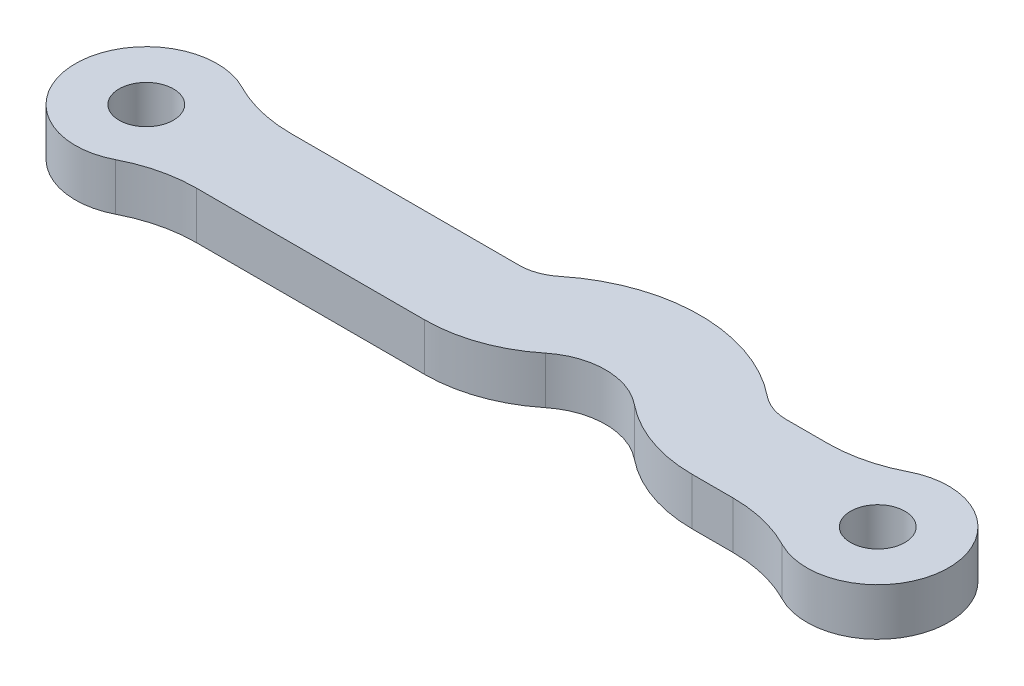
ISO-10303-21;
HEADER;
FILE_DESCRIPTION(('STEP AP214'),'2;1');
FILE_NAME('part.step','',(''),(''),'','','');
FILE_SCHEMA(('AUTOMOTIVE_DESIGN { 1 0 10303 214 1 1 1 1 }'));
ENDSEC;
DATA;
#1=APPLICATION_CONTEXT('core data for automotive mechanical design processes');
#2=APPLICATION_PROTOCOL_DEFINITION('international standard','automotive_design',2000,#1);
#3=PRODUCT_CONTEXT('',#1,'mechanical');
#4=PRODUCT('Part','Part','',(#3));
#5=PRODUCT_RELATED_PRODUCT_CATEGORY('part','',(#4));
#6=PRODUCT_DEFINITION_FORMATION('','',#4);
#7=PRODUCT_DEFINITION_CONTEXT('part definition',#1,'design');
#8=PRODUCT_DEFINITION('design','',#6,#7);
#9=PRODUCT_DEFINITION_SHAPE('','',#8);
#10=(LENGTH_UNIT() NAMED_UNIT(*) SI_UNIT(.MILLI.,.METRE.));
#11=(NAMED_UNIT(*) PLANE_ANGLE_UNIT() SI_UNIT($,.RADIAN.));
#12=(NAMED_UNIT(*) SI_UNIT($,.STERADIAN.) SOLID_ANGLE_UNIT());
#13=UNCERTAINTY_MEASURE_WITH_UNIT(LENGTH_MEASURE(1.E-05),#10,'distance_accuracy_value','');
#14=(GEOMETRIC_REPRESENTATION_CONTEXT(3) GLOBAL_UNCERTAINTY_ASSIGNED_CONTEXT((#13)) GLOBAL_UNIT_ASSIGNED_CONTEXT((#10,
#11,#12)) REPRESENTATION_CONTEXT('',''));
#15=CARTESIAN_POINT('',(0.,0.,0.));
#16=DIRECTION('',(0.,0.,1.));
#17=DIRECTION('',(1.,0.,0.));
#18=AXIS2_PLACEMENT_3D('',#15,#16,#17);
#19=CARTESIAN_POINT('',(0.,2.,2.));
#20=DIRECTION('',(0.,0.,1.));
#21=DIRECTION('',(1.,0.,0.));
#22=AXIS2_PLACEMENT_3D('',#19,#20,#21);
#23=PLANE('',#22);
#24=DIRECTION('',(-1.,0.,0.));
#25=VECTOR('',#24,1.);
#26=CARTESIAN_POINT('',(0.,2.,2.));
#27=LINE('',#26,#25);
#28=CARTESIAN_POINT('',(26.8268943743823,2.,2.));
#29=VERTEX_POINT('',#28);
#30=CARTESIAN_POINT('',(25.0912127128692,2.,2.));
#31=VERTEX_POINT('',#30);
#32=EDGE_CURVE('E287',#29,#31,#27,.T.);
#33=ORIENTED_EDGE('',*,*,#32,.T.);
#34=DIRECTION('',(0.,-1.,0.));
#35=VECTOR('',#34,1.);
#36=CARTESIAN_POINT('',(25.0912127128692,2.,2.));
#37=LINE('',#36,#35);
#38=CARTESIAN_POINT('',(25.0912127128692,0.,2.));
#39=VERTEX_POINT('',#38);
#40=EDGE_CURVE('E216',#31,#39,#37,.T.);
#41=ORIENTED_EDGE('',*,*,#40,.T.);
#42=DIRECTION('',(-1.,0.,0.));
#43=VECTOR('',#42,1.);
#44=CARTESIAN_POINT('',(0.,0.,2.));
#45=LINE('',#44,#43);
#46=CARTESIAN_POINT('',(26.8268943743823,0.,2.));
#47=VERTEX_POINT('',#46);
#48=EDGE_CURVE('E273',#47,#39,#45,.T.);
#49=ORIENTED_EDGE('',*,*,#48,.F.);
#50=DIRECTION('',(0.,-1.,0.));
#51=VECTOR('',#50,1.);
#52=CARTESIAN_POINT('',(26.8268943743823,2.,2.));
#53=LINE('',#52,#51);
#54=EDGE_CURVE('E191',#47,#29,#53,.F.);
#55=ORIENTED_EDGE('',*,*,#54,.T.);
#56=EDGE_LOOP('',(#33,#41,#49,#55));
#57=FACE_BOUND('',#56,.T.);
#58=ADVANCED_FACE('F36',(#57),#23,.T.);
#59=CARTESIAN_POINT('',(30.95,2.,0.));
#60=DIRECTION('',(0.,-1.,0.));
#61=DIRECTION('',(0.,0.,-1.));
#62=AXIS2_PLACEMENT_3D('',#59,#60,#61);
#63=CYLINDRICAL_SURFACE('',#62,3.);
#64=CARTESIAN_POINT('',(30.95,0.,0.));
#65=DIRECTION('',(0.,1.,0.));
#66=DIRECTION('',(0.,0.,1.));
#67=AXIS2_PLACEMENT_3D('',#64,#65,#66);
#68=CIRCLE('',#67,3.);
#69=CARTESIAN_POINT('',(29.5756314581274,0.,2.66666666666667));
#70=VERTEX_POINT('',#69);
#71=CARTESIAN_POINT('',(29.5756314581274,0.,-2.66666666666667));
#72=VERTEX_POINT('',#71);
#73=EDGE_CURVE('E162',#70,#72,#68,.T.);
#74=ORIENTED_EDGE('',*,*,#73,.T.);
#75=DIRECTION('',(0.,-1.,0.));
#76=VECTOR('',#75,1.);
#77=CARTESIAN_POINT('',(29.5756314581274,2.,-2.66666666666667));
#78=LINE('',#77,#76);
#79=CARTESIAN_POINT('',(29.5756314581274,2.,-2.66666666666667));
#80=VERTEX_POINT('',#79);
#81=EDGE_CURVE('E170',#72,#80,#78,.F.);
#82=ORIENTED_EDGE('',*,*,#81,.T.);
#83=CARTESIAN_POINT('',(30.95,2.,0.));
#84=DIRECTION('',(0.,1.,0.));
#85=DIRECTION('',(0.,0.,1.));
#86=AXIS2_PLACEMENT_3D('',#83,#84,#85);
#87=CIRCLE('',#86,3.);
#88=CARTESIAN_POINT('',(29.5756314581274,2.,2.66666666666667));
#89=VERTEX_POINT('',#88);
#90=EDGE_CURVE('E291',#89,#80,#87,.T.);
#91=ORIENTED_EDGE('',*,*,#90,.F.);
#92=DIRECTION('',(0.,-1.,0.));
#93=VECTOR('',#92,1.);
#94=CARTESIAN_POINT('',(29.5756314581274,2.,2.66666666666667));
#95=LINE('',#94,#93);
#96=EDGE_CURVE('E178',#89,#70,#95,.T.);
#97=ORIENTED_EDGE('',*,*,#96,.T.);
#98=EDGE_LOOP('',(#74,#82,#91,#97));
#99=FACE_BOUND('',#98,.T.);
#100=ADVANCED_FACE('F333',(#99),#63,.T.);
#101=CARTESIAN_POINT('',(0.,2.,-2.));
#102=DIRECTION('',(0.,0.,-1.));
#103=DIRECTION('',(-1.,0.,0.));
#104=AXIS2_PLACEMENT_3D('',#101,#102,#103);
#105=PLANE('',#104);
#106=DIRECTION('',(1.,0.,0.));
#107=VECTOR('',#106,1.);
#108=CARTESIAN_POINT('',(0.,0.,-2.));
#109=LINE('',#108,#107);
#110=CARTESIAN_POINT('',(25.0912127128692,0.,-2.));
#111=VERTEX_POINT('',#110);
#112=CARTESIAN_POINT('',(26.8268943743823,0.,-2.));
#113=VERTEX_POINT('',#112);
#114=EDGE_CURVE('E148',#111,#113,#109,.T.);
#115=ORIENTED_EDGE('',*,*,#114,.F.);
#116=DIRECTION('',(0.,-1.,0.));
#117=VECTOR('',#116,1.);
#118=CARTESIAN_POINT('',(25.0912127128692,2.,-2.));
#119=LINE('',#118,#117);
#120=CARTESIAN_POINT('',(25.0912127128692,2.,-2.));
#121=VERTEX_POINT('',#120);
#122=EDGE_CURVE('E239',#111,#121,#119,.F.);
#123=ORIENTED_EDGE('',*,*,#122,.T.);
#124=DIRECTION('',(1.,0.,0.));
#125=VECTOR('',#124,1.);
#126=CARTESIAN_POINT('',(0.,2.,-2.));
#127=LINE('',#126,#125);
#128=CARTESIAN_POINT('',(26.8268943743823,2.,-2.));
#129=VERTEX_POINT('',#128);
#130=EDGE_CURVE('E176',#121,#129,#127,.T.);
#131=ORIENTED_EDGE('',*,*,#130,.T.);
#132=DIRECTION('',(0.,-1.,0.));
#133=VECTOR('',#132,1.);
#134=CARTESIAN_POINT('',(26.8268943743823,2.,-2.));
#135=LINE('',#134,#133);
#136=EDGE_CURVE('E169',#129,#113,#135,.T.);
#137=ORIENTED_EDGE('',*,*,#136,.T.);
#138=EDGE_LOOP('',(#115,#123,#131,#137));
#139=FACE_BOUND('',#138,.T.);
#140=ADVANCED_FACE('F174',(#139),#105,.T.);
#141=CARTESIAN_POINT('',(19.4343584633769,2.,3.));
#142=DIRECTION('',(0.,-1.,0.));
#143=DIRECTION('',(0.,0.,-1.));
#144=AXIS2_PLACEMENT_3D('',#141,#142,#143);
#145=CYLINDRICAL_SURFACE('',#144,7.);
#146=CARTESIAN_POINT('',(19.4343584633769,2.,3.));
#147=DIRECTION('',(0.,1.,0.));
#148=DIRECTION('',(0.,0.,1.));
#149=AXIS2_PLACEMENT_3D('',#146,#147,#148);
#150=CIRCLE('',#149,7.);
#151=CARTESIAN_POINT('',(23.8341339907598,2.,-2.44444444444444));
#152=VERTEX_POINT('',#151);
#153=CARTESIAN_POINT('',(15.0345829359939,2.,-2.44444444444444));
#154=VERTEX_POINT('',#153);
#155=EDGE_CURVE('E260',#152,#154,#150,.T.);
#156=ORIENTED_EDGE('',*,*,#155,.F.);
#157=DIRECTION('',(0.,-1.,0.));
#158=VECTOR('',#157,1.);
#159=CARTESIAN_POINT('',(23.8341339907598,2.,-2.44444444444444));
#160=LINE('',#159,#158);
#161=CARTESIAN_POINT('',(23.8341339907598,0.,-2.44444444444444));
#162=VERTEX_POINT('',#161);
#163=EDGE_CURVE('E236',#152,#162,#160,.T.);
#164=ORIENTED_EDGE('',*,*,#163,.T.);
#165=CARTESIAN_POINT('',(19.4343584633769,0.,3.));
#166=DIRECTION('',(0.,1.,0.));
#167=DIRECTION('',(0.,0.,1.));
#168=AXIS2_PLACEMENT_3D('',#165,#166,#167);
#169=CIRCLE('',#168,7.);
#170=CARTESIAN_POINT('',(15.0345829359939,0.,-2.44444444444444));
#171=VERTEX_POINT('',#170);
#172=EDGE_CURVE('E161',#162,#171,#169,.T.);
#173=ORIENTED_EDGE('',*,*,#172,.T.);
#174=DIRECTION('',(0.,-1.,0.));
#175=VECTOR('',#174,1.);
#176=CARTESIAN_POINT('',(15.0345829359939,2.,-2.44444444444444));
#177=LINE('',#176,#175);
#178=EDGE_CURVE('E234',#171,#154,#177,.F.);
#179=ORIENTED_EDGE('',*,*,#178,.T.);
#180=EDGE_LOOP('',(#156,#164,#173,#179));
#181=FACE_BOUND('',#180,.T.);
#182=ADVANCED_FACE('F251',(#181),#145,.T.);
#183=CARTESIAN_POINT('',(0.,2.,-2.));
#184=DIRECTION('',(0.,0.,-1.));
#185=DIRECTION('',(-1.,0.,0.));
#186=AXIS2_PLACEMENT_3D('',#183,#184,#185);
#187=PLANE('',#186);
#188=DIRECTION('',(1.,0.,0.));
#189=VECTOR('',#188,1.);
#190=CARTESIAN_POINT('',(0.,2.,-2.));
#191=LINE('',#190,#189);
#192=CARTESIAN_POINT('',(4.12310562561766,2.,-2.));
#193=VERTEX_POINT('',#192);
#194=CARTESIAN_POINT('',(13.7775042138845,2.,-2.));
#195=VERTEX_POINT('',#194);
#196=EDGE_CURVE('E257',#193,#195,#191,.T.);
#197=ORIENTED_EDGE('',*,*,#196,.T.);
#198=DIRECTION('',(0.,-1.,0.));
#199=VECTOR('',#198,1.);
#200=CARTESIAN_POINT('',(13.7775042138845,2.,-2.));
#201=LINE('',#200,#199);
#202=CARTESIAN_POINT('',(13.7775042138845,0.,-2.));
#203=VERTEX_POINT('',#202);
#204=EDGE_CURVE('E241',#195,#203,#201,.T.);
#205=ORIENTED_EDGE('',*,*,#204,.T.);
#206=DIRECTION('',(1.,0.,0.));
#207=VECTOR('',#206,1.);
#208=CARTESIAN_POINT('',(0.,0.,-2.));
#209=LINE('',#208,#207);
#210=CARTESIAN_POINT('',(4.12310562561766,0.,-2.));
#211=VERTEX_POINT('',#210);
#212=EDGE_CURVE('E248',#211,#203,#209,.T.);
#213=ORIENTED_EDGE('',*,*,#212,.F.);
#214=DIRECTION('',(0.,-1.,0.));
#215=VECTOR('',#214,1.);
#216=CARTESIAN_POINT('',(4.12310562561766,2.,-2.));
#217=LINE('',#216,#215);
#218=EDGE_CURVE('E172',#211,#193,#217,.F.);
#219=ORIENTED_EDGE('',*,*,#218,.T.);
#220=EDGE_LOOP('',(#197,#205,#213,#219));
#221=FACE_BOUND('',#220,.T.);
#222=ADVANCED_FACE('F255',(#221),#187,.T.);
#223=CARTESIAN_POINT('',(0.,2.,0.));
#224=DIRECTION('',(0.,-1.,0.));
#225=DIRECTION('',(0.,0.,-1.));
#226=AXIS2_PLACEMENT_3D('',#223,#224,#225);
#227=CYLINDRICAL_SURFACE('',#226,3.);
#228=CARTESIAN_POINT('',(0.,0.,0.));
#229=DIRECTION('',(0.,1.,0.));
#230=DIRECTION('',(0.,0.,1.));
#231=AXIS2_PLACEMENT_3D('',#228,#229,#230);
#232=CIRCLE('',#231,3.);
#233=CARTESIAN_POINT('',(1.37436854187255,0.,-2.66666666666667));
#234=VERTEX_POINT('',#233);
#235=CARTESIAN_POINT('',(1.37436854187255,0.,2.66666666666667));
#236=VERTEX_POINT('',#235);
#237=EDGE_CURVE('E278',#234,#236,#232,.T.);
#238=ORIENTED_EDGE('',*,*,#237,.T.);
#239=DIRECTION('',(0.,-1.,0.));
#240=VECTOR('',#239,1.);
#241=CARTESIAN_POINT('',(1.37436854187255,2.,2.66666666666667));
#242=LINE('',#241,#240);
#243=CARTESIAN_POINT('',(1.37436854187255,2.,2.66666666666667));
#244=VERTEX_POINT('',#243);
#245=EDGE_CURVE('E199',#236,#244,#242,.F.);
#246=ORIENTED_EDGE('',*,*,#245,.T.);
#247=CARTESIAN_POINT('',(0.,2.,0.));
#248=DIRECTION('',(0.,1.,0.));
#249=DIRECTION('',(0.,0.,1.));
#250=AXIS2_PLACEMENT_3D('',#247,#248,#249);
#251=CIRCLE('',#250,3.);
#252=CARTESIAN_POINT('',(1.37436854187255,2.,-2.66666666666667));
#253=VERTEX_POINT('',#252);
#254=EDGE_CURVE('E259',#253,#244,#251,.T.);
#255=ORIENTED_EDGE('',*,*,#254,.F.);
#256=DIRECTION('',(0.,-1.,0.));
#257=VECTOR('',#256,1.);
#258=CARTESIAN_POINT('',(1.37436854187255,2.,-2.66666666666667));
#259=LINE('',#258,#257);
#260=EDGE_CURVE('E196',#253,#234,#259,.T.);
#261=ORIENTED_EDGE('',*,*,#260,.T.);
#262=EDGE_LOOP('',(#238,#246,#255,#261));
#263=FACE_BOUND('',#262,.T.);
#264=ADVANCED_FACE('F316',(#263),#227,.T.);
#265=CARTESIAN_POINT('',(13.7775042138845,0.,2.));
#266=VERTEX_POINT('',#265);
#267=CARTESIAN_POINT('',(4.12310562561766,0.,2.));
#268=VERTEX_POINT('',#267);
#269=EDGE_CURVE('E275',#266,#268,#45,.T.);
#270=ORIENTED_EDGE('',*,*,#269,.F.);
#271=DIRECTION('',(0.,-1.,0.));
#272=VECTOR('',#271,1.);
#273=CARTESIAN_POINT('',(13.7775042138845,2.,2.));
#274=LINE('',#273,#272);
#275=CARTESIAN_POINT('',(13.7775042138845,2.,2.));
#276=VERTEX_POINT('',#275);
#277=EDGE_CURVE('E232',#266,#276,#274,.F.);
#278=ORIENTED_EDGE('',*,*,#277,.T.);
#279=CARTESIAN_POINT('',(4.12310562561766,2.,2.));
#280=VERTEX_POINT('',#279);
#281=EDGE_CURVE('E263',#276,#280,#27,.T.);
#282=ORIENTED_EDGE('',*,*,#281,.T.);
#283=DIRECTION('',(0.,-1.,0.));
#284=VECTOR('',#283,1.);
#285=CARTESIAN_POINT('',(4.12310562561766,2.,2.));
#286=LINE('',#285,#284);
#287=EDGE_CURVE('E193',#280,#268,#286,.T.);
#288=ORIENTED_EDGE('',*,*,#287,.T.);
#289=EDGE_LOOP('',(#270,#278,#282,#288));
#290=FACE_BOUND('',#289,.T.);
#291=ADVANCED_FACE('F301',(#290),#23,.T.);
#292=CARTESIAN_POINT('',(0.,2.,0.));
#293=DIRECTION('',(0.,-1.,0.));
#294=DIRECTION('',(0.,0.,-1.));
#295=AXIS2_PLACEMENT_3D('',#292,#293,#294);
#296=CYLINDRICAL_SURFACE('',#295,1.15);
#297=CARTESIAN_POINT('',(0.,2.,0.));
#298=DIRECTION('',(0.,1.,0.));
#299=DIRECTION('',(0.,0.,1.));
#300=AXIS2_PLACEMENT_3D('',#297,#298,#299);
#301=CIRCLE('',#300,1.15);
#302=CARTESIAN_POINT('',(0.,2.,1.15));
#303=VERTEX_POINT('',#302);
#304=EDGE_CURVE('E184',#303,#303,#301,.T.);
#305=ORIENTED_EDGE('',*,*,#304,.T.);
#306=EDGE_LOOP('',(#305));
#307=FACE_BOUND('',#306,.T.);
#308=CARTESIAN_POINT('',(0.,0.,0.));
#309=DIRECTION('',(0.,1.,0.));
#310=DIRECTION('',(0.,0.,1.));
#311=AXIS2_PLACEMENT_3D('',#308,#309,#310);
#312=CIRCLE('',#311,1.15);
#313=CARTESIAN_POINT('',(0.,0.,1.15));
#314=VERTEX_POINT('',#313);
#315=EDGE_CURVE('E283',#314,#314,#312,.T.);
#316=ORIENTED_EDGE('',*,*,#315,.F.);
#317=EDGE_LOOP('',(#316));
#318=FACE_BOUND('',#317,.T.);
#319=ADVANCED_FACE('F343',(#307,#318),#296,.F.);
#320=CARTESIAN_POINT('',(19.4343584633769,2.,3.));
#321=DIRECTION('',(0.,-1.,0.));
#322=DIRECTION('',(0.,0.,-1.));
#323=AXIS2_PLACEMENT_3D('',#320,#321,#322);
#324=CYLINDRICAL_SURFACE('',#323,3.);
#325=CARTESIAN_POINT('',(19.4343584633769,0.,3.));
#326=DIRECTION('',(0.,1.,0.));
#327=DIRECTION('',(0.,0.,1.));
#328=AXIS2_PLACEMENT_3D('',#325,#326,#327);
#329=CIRCLE('',#328,3.);
#330=CARTESIAN_POINT('',(21.319976546541,0.,0.666666666666665));
#331=VERTEX_POINT('',#330);
#332=CARTESIAN_POINT('',(17.5487403802127,0.,0.666666666666665));
#333=VERTEX_POINT('',#332);
#334=EDGE_CURVE('E281',#331,#333,#329,.T.);
#335=ORIENTED_EDGE('',*,*,#334,.F.);
#336=DIRECTION('',(0.,-1.,0.));
#337=VECTOR('',#336,1.);
#338=CARTESIAN_POINT('',(21.319976546541,2.,0.666666666666666));
#339=LINE('',#338,#337);
#340=CARTESIAN_POINT('',(21.319976546541,2.,0.666666666666665));
#341=VERTEX_POINT('',#340);
#342=EDGE_CURVE('E226',#331,#341,#339,.F.);
#343=ORIENTED_EDGE('',*,*,#342,.T.);
#344=CARTESIAN_POINT('',(19.4343584633769,2.,3.));
#345=DIRECTION('',(0.,1.,0.));
#346=DIRECTION('',(0.,0.,1.));
#347=AXIS2_PLACEMENT_3D('',#344,#345,#346);
#348=CIRCLE('',#347,3.);
#349=CARTESIAN_POINT('',(17.5487403802127,2.,0.666666666666665));
#350=VERTEX_POINT('',#349);
#351=EDGE_CURVE('E268',#341,#350,#348,.T.);
#352=ORIENTED_EDGE('',*,*,#351,.T.);
#353=DIRECTION('',(0.,-1.,0.));
#354=VECTOR('',#353,1.);
#355=CARTESIAN_POINT('',(17.5487403802127,2.,0.666666666666666));
#356=LINE('',#355,#354);
#357=EDGE_CURVE('E223',#350,#333,#356,.T.);
#358=ORIENTED_EDGE('',*,*,#357,.T.);
#359=EDGE_LOOP('',(#335,#343,#352,#358));
#360=FACE_BOUND('',#359,.T.);
#361=ADVANCED_FACE('F348',(#360),#324,.F.);
#362=CARTESIAN_POINT('',(30.95,2.,0.));
#363=DIRECTION('',(0.,-1.,0.));
#364=DIRECTION('',(0.,0.,-1.));
#365=AXIS2_PLACEMENT_3D('',#362,#363,#364);
#366=CYLINDRICAL_SURFACE('',#365,1.15);
#367=CARTESIAN_POINT('',(30.95,2.,0.));
#368=DIRECTION('',(0.,1.,0.));
#369=DIRECTION('',(0.,0.,1.));
#370=AXIS2_PLACEMENT_3D('',#367,#368,#369);
#371=CIRCLE('',#370,1.15);
#372=CARTESIAN_POINT('',(30.95,2.,1.15));
#373=VERTEX_POINT('',#372);
#374=EDGE_CURVE('E179',#373,#373,#371,.T.);
#375=ORIENTED_EDGE('',*,*,#374,.T.);
#376=EDGE_LOOP('',(#375));
#377=FACE_BOUND('',#376,.T.);
#378=CARTESIAN_POINT('',(30.95,0.,0.));
#379=DIRECTION('',(0.,1.,0.));
#380=DIRECTION('',(0.,0.,1.));
#381=AXIS2_PLACEMENT_3D('',#378,#379,#380);
#382=CIRCLE('',#381,1.15);
#383=CARTESIAN_POINT('',(30.95,0.,1.15));
#384=VERTEX_POINT('',#383);
#385=EDGE_CURVE('E187',#384,#384,#382,.T.);
#386=ORIENTED_EDGE('',*,*,#385,.F.);
#387=EDGE_LOOP('',(#386));
#388=FACE_BOUND('',#387,.T.);
#389=ADVANCED_FACE('F414',(#377,#388),#366,.F.);
#390=CARTESIAN_POINT('',(0.,2.,0.));
#391=DIRECTION('',(0.,1.,0.));
#392=DIRECTION('',(0.,0.,1.));
#393=AXIS2_PLACEMENT_3D('',#390,#391,#392);
#394=PLANE('',#393);
#395=ORIENTED_EDGE('',*,*,#351,.F.);
#396=CARTESIAN_POINT('',(25.0912127128692,2.,-4.));
#397=DIRECTION('',(0.,1.,0.));
#398=DIRECTION('',(0.,0.,1.));
#399=AXIS2_PLACEMENT_3D('',#396,#397,#398);
#400=CIRCLE('',#399,6.);
#401=EDGE_CURVE('E230',#341,#31,#400,.T.);
#402=ORIENTED_EDGE('',*,*,#401,.T.);
#403=ORIENTED_EDGE('',*,*,#32,.F.);
#404=CARTESIAN_POINT('',(26.8268943743823,2.,8.));
#405=DIRECTION('',(0.,1.,0.));
#406=DIRECTION('',(0.,0.,1.));
#407=AXIS2_PLACEMENT_3D('',#404,#405,#406);
#408=CIRCLE('',#407,6.);
#409=EDGE_CURVE('E205',#29,#89,#408,.F.);
#410=ORIENTED_EDGE('',*,*,#409,.T.);
#411=ORIENTED_EDGE('',*,*,#90,.T.);
#412=CARTESIAN_POINT('',(26.8268943743823,2.,-8.));
#413=DIRECTION('',(0.,1.,0.));
#414=DIRECTION('',(0.,0.,1.));
#415=AXIS2_PLACEMENT_3D('',#412,#413,#414);
#416=CIRCLE('',#415,6.);
#417=EDGE_CURVE('E171',#80,#129,#416,.F.);
#418=ORIENTED_EDGE('',*,*,#417,.T.);
#419=ORIENTED_EDGE('',*,*,#130,.F.);
#420=CARTESIAN_POINT('',(25.0912127128692,2.,-4.));
#421=DIRECTION('',(0.,1.,0.));
#422=DIRECTION('',(0.,0.,1.));
#423=AXIS2_PLACEMENT_3D('',#420,#421,#422);
#424=CIRCLE('',#423,2.);
#425=EDGE_CURVE('E244',#121,#152,#424,.F.);
#426=ORIENTED_EDGE('',*,*,#425,.T.);
#427=ORIENTED_EDGE('',*,*,#155,.T.);
#428=CARTESIAN_POINT('',(13.7775042138845,2.,-4.));
#429=DIRECTION('',(0.,1.,0.));
#430=DIRECTION('',(0.,0.,1.));
#431=AXIS2_PLACEMENT_3D('',#428,#429,#430);
#432=CIRCLE('',#431,2.);
#433=EDGE_CURVE('E11',#154,#195,#432,.F.);
#434=ORIENTED_EDGE('',*,*,#433,.T.);
#435=ORIENTED_EDGE('',*,*,#196,.F.);
#436=CARTESIAN_POINT('',(4.12310562561766,2.,-8.));
#437=DIRECTION('',(0.,1.,0.));
#438=DIRECTION('',(0.,0.,1.));
#439=AXIS2_PLACEMENT_3D('',#436,#437,#438);
#440=CIRCLE('',#439,6.);
#441=EDGE_CURVE('E214',#193,#253,#440,.F.);
#442=ORIENTED_EDGE('',*,*,#441,.T.);
#443=ORIENTED_EDGE('',*,*,#254,.T.);
#444=CARTESIAN_POINT('',(4.12310562561766,2.,8.));
#445=DIRECTION('',(0.,1.,0.));
#446=DIRECTION('',(0.,0.,1.));
#447=AXIS2_PLACEMENT_3D('',#444,#445,#446);
#448=CIRCLE('',#447,6.);
#449=EDGE_CURVE('E209',#244,#280,#448,.F.);
#450=ORIENTED_EDGE('',*,*,#449,.T.);
#451=ORIENTED_EDGE('',*,*,#281,.F.);
#452=CARTESIAN_POINT('',(13.7775042138845,2.,-4.));
#453=DIRECTION('',(0.,1.,0.));
#454=DIRECTION('',(0.,0.,1.));
#455=AXIS2_PLACEMENT_3D('',#452,#453,#454);
#456=CIRCLE('',#455,6.);
#457=EDGE_CURVE('E228',#276,#350,#456,.T.);
#458=ORIENTED_EDGE('',*,*,#457,.T.);
#459=EDGE_LOOP('',(#395,#402,#403,#410,#411,#418,#419,#426,#427,#434,#435,#442,#443,#450,#451,#458));
#460=FACE_BOUND('',#459,.T.);
#461=ORIENTED_EDGE('',*,*,#304,.F.);
#462=EDGE_LOOP('',(#461));
#463=FACE_BOUND('',#462,.T.);
#464=ORIENTED_EDGE('',*,*,#374,.F.);
#465=EDGE_LOOP('',(#464));
#466=FACE_BOUND('',#465,.T.);
#467=ADVANCED_FACE('F307',(#460,#463,#466),#394,.T.);
#468=CARTESIAN_POINT('',(0.,0.,0.));
#469=DIRECTION('',(0.,1.,0.));
#470=DIRECTION('',(0.,0.,1.));
#471=AXIS2_PLACEMENT_3D('',#468,#469,#470);
#472=PLANE('',#471);
#473=ORIENTED_EDGE('',*,*,#48,.T.);
#474=CARTESIAN_POINT('',(25.0912127128692,0.,-4.));
#475=DIRECTION('',(0.,1.,0.));
#476=DIRECTION('',(0.,0.,1.));
#477=AXIS2_PLACEMENT_3D('',#474,#475,#476);
#478=CIRCLE('',#477,6.);
#479=EDGE_CURVE('E221',#39,#331,#478,.F.);
#480=ORIENTED_EDGE('',*,*,#479,.T.);
#481=ORIENTED_EDGE('',*,*,#334,.T.);
#482=CARTESIAN_POINT('',(13.7775042138845,0.,-4.));
#483=DIRECTION('',(0.,1.,0.));
#484=DIRECTION('',(0.,0.,1.));
#485=AXIS2_PLACEMENT_3D('',#482,#483,#484);
#486=CIRCLE('',#485,6.);
#487=EDGE_CURVE('E219',#333,#266,#486,.F.);
#488=ORIENTED_EDGE('',*,*,#487,.T.);
#489=ORIENTED_EDGE('',*,*,#269,.T.);
#490=CARTESIAN_POINT('',(4.12310562561766,0.,8.));
#491=DIRECTION('',(0.,1.,0.));
#492=DIRECTION('',(0.,0.,1.));
#493=AXIS2_PLACEMENT_3D('',#490,#491,#492);
#494=CIRCLE('',#493,6.);
#495=EDGE_CURVE('E207',#268,#236,#494,.T.);
#496=ORIENTED_EDGE('',*,*,#495,.T.);
#497=ORIENTED_EDGE('',*,*,#237,.F.);
#498=CARTESIAN_POINT('',(4.12310562561766,0.,-8.));
#499=DIRECTION('',(0.,1.,0.));
#500=DIRECTION('',(0.,0.,1.));
#501=AXIS2_PLACEMENT_3D('',#498,#499,#500);
#502=CIRCLE('',#501,6.);
#503=EDGE_CURVE('E212',#234,#211,#502,.T.);
#504=ORIENTED_EDGE('',*,*,#503,.T.);
#505=ORIENTED_EDGE('',*,*,#212,.T.);
#506=CARTESIAN_POINT('',(13.7775042138845,0.,-4.));
#507=DIRECTION('',(0.,1.,0.));
#508=DIRECTION('',(0.,0.,1.));
#509=AXIS2_PLACEMENT_3D('',#506,#507,#508);
#510=CIRCLE('',#509,2.);
#511=EDGE_CURVE('E44',#203,#171,#510,.T.);
#512=ORIENTED_EDGE('',*,*,#511,.T.);
#513=ORIENTED_EDGE('',*,*,#172,.F.);
#514=CARTESIAN_POINT('',(25.0912127128692,0.,-4.));
#515=DIRECTION('',(0.,1.,0.));
#516=DIRECTION('',(0.,0.,1.));
#517=AXIS2_PLACEMENT_3D('',#514,#515,#516);
#518=CIRCLE('',#517,2.);
#519=EDGE_CURVE('E157',#162,#111,#518,.T.);
#520=ORIENTED_EDGE('',*,*,#519,.T.);
#521=ORIENTED_EDGE('',*,*,#114,.T.);
#522=CARTESIAN_POINT('',(26.8268943743823,0.,-8.));
#523=DIRECTION('',(0.,1.,0.));
#524=DIRECTION('',(0.,0.,1.));
#525=AXIS2_PLACEMENT_3D('',#522,#523,#524);
#526=CIRCLE('',#525,6.);
#527=EDGE_CURVE('E154',#113,#72,#526,.T.);
#528=ORIENTED_EDGE('',*,*,#527,.T.);
#529=ORIENTED_EDGE('',*,*,#73,.F.);
#530=CARTESIAN_POINT('',(26.8268943743823,0.,8.));
#531=DIRECTION('',(0.,1.,0.));
#532=DIRECTION('',(0.,0.,1.));
#533=AXIS2_PLACEMENT_3D('',#530,#531,#532);
#534=CIRCLE('',#533,6.);
#535=EDGE_CURVE('E203',#70,#47,#534,.T.);
#536=ORIENTED_EDGE('',*,*,#535,.T.);
#537=EDGE_LOOP('',(#473,#480,#481,#488,#489,#496,#497,#504,#505,#512,#513,#520,#521,#528,#529,#536));
#538=FACE_BOUND('',#537,.T.);
#539=ORIENTED_EDGE('',*,*,#315,.T.);
#540=EDGE_LOOP('',(#539));
#541=FACE_BOUND('',#540,.T.);
#542=ORIENTED_EDGE('',*,*,#385,.T.);
#543=EDGE_LOOP('',(#542));
#544=FACE_BOUND('',#543,.T.);
#545=ADVANCED_FACE('F151',(#538,#541,#544),#472,.F.);
#546=CARTESIAN_POINT('',(26.8268943743823,2.,-8.));
#547=DIRECTION('',(0.,-1.,0.));
#548=DIRECTION('',(0.,0.,-1.));
#549=AXIS2_PLACEMENT_3D('',#546,#547,#548);
#550=CYLINDRICAL_SURFACE('',#549,6.);
#551=ORIENTED_EDGE('',*,*,#417,.F.);
#552=ORIENTED_EDGE('',*,*,#81,.F.);
#553=ORIENTED_EDGE('',*,*,#527,.F.);
#554=ORIENTED_EDGE('',*,*,#136,.F.);
#555=EDGE_LOOP('',(#551,#552,#553,#554));
#556=FACE_BOUND('',#555,.T.);
#557=ADVANCED_FACE('F168',(#556),#550,.F.);
#558=CARTESIAN_POINT('',(26.8268943743823,2.,8.));
#559=DIRECTION('',(0.,-1.,0.));
#560=DIRECTION('',(0.,0.,-1.));
#561=AXIS2_PLACEMENT_3D('',#558,#559,#560);
#562=CYLINDRICAL_SURFACE('',#561,6.);
#563=ORIENTED_EDGE('',*,*,#409,.F.);
#564=ORIENTED_EDGE('',*,*,#54,.F.);
#565=ORIENTED_EDGE('',*,*,#535,.F.);
#566=ORIENTED_EDGE('',*,*,#96,.F.);
#567=EDGE_LOOP('',(#563,#564,#565,#566));
#568=FACE_BOUND('',#567,.T.);
#569=ADVANCED_FACE('F330',(#568),#562,.F.);
#570=CARTESIAN_POINT('',(4.12310562561766,2.,8.));
#571=DIRECTION('',(0.,-1.,0.));
#572=DIRECTION('',(0.,0.,-1.));
#573=AXIS2_PLACEMENT_3D('',#570,#571,#572);
#574=CYLINDRICAL_SURFACE('',#573,6.);
#575=ORIENTED_EDGE('',*,*,#449,.F.);
#576=ORIENTED_EDGE('',*,*,#245,.F.);
#577=ORIENTED_EDGE('',*,*,#495,.F.);
#578=ORIENTED_EDGE('',*,*,#287,.F.);
#579=EDGE_LOOP('',(#575,#576,#577,#578));
#580=FACE_BOUND('',#579,.T.);
#581=ADVANCED_FACE('F313',(#580),#574,.F.);
#582=CARTESIAN_POINT('',(4.12310562561766,2.,-8.));
#583=DIRECTION('',(0.,-1.,0.));
#584=DIRECTION('',(0.,0.,-1.));
#585=AXIS2_PLACEMENT_3D('',#582,#583,#584);
#586=CYLINDRICAL_SURFACE('',#585,6.);
#587=ORIENTED_EDGE('',*,*,#441,.F.);
#588=ORIENTED_EDGE('',*,*,#218,.F.);
#589=ORIENTED_EDGE('',*,*,#503,.F.);
#590=ORIENTED_EDGE('',*,*,#260,.F.);
#591=EDGE_LOOP('',(#587,#588,#589,#590));
#592=FACE_BOUND('',#591,.T.);
#593=ADVANCED_FACE('F319',(#592),#586,.F.);
#594=CARTESIAN_POINT('',(25.0912127128692,2.,-4.));
#595=DIRECTION('',(0.,-1.,0.));
#596=DIRECTION('',(0.,0.,-1.));
#597=AXIS2_PLACEMENT_3D('',#594,#595,#596);
#598=CYLINDRICAL_SURFACE('',#597,6.);
#599=ORIENTED_EDGE('',*,*,#401,.F.);
#600=ORIENTED_EDGE('',*,*,#342,.F.);
#601=ORIENTED_EDGE('',*,*,#479,.F.);
#602=ORIENTED_EDGE('',*,*,#40,.F.);
#603=EDGE_LOOP('',(#599,#600,#601,#602));
#604=FACE_BOUND('',#603,.T.);
#605=ADVANCED_FACE('F321',(#604),#598,.T.);
#606=CARTESIAN_POINT('',(13.7775042138845,2.,-4.));
#607=DIRECTION('',(0.,-1.,0.));
#608=DIRECTION('',(0.,0.,-1.));
#609=AXIS2_PLACEMENT_3D('',#606,#607,#608);
#610=CYLINDRICAL_SURFACE('',#609,6.);
#611=ORIENTED_EDGE('',*,*,#457,.F.);
#612=ORIENTED_EDGE('',*,*,#277,.F.);
#613=ORIENTED_EDGE('',*,*,#487,.F.);
#614=ORIENTED_EDGE('',*,*,#357,.F.);
#615=EDGE_LOOP('',(#611,#612,#613,#614));
#616=FACE_BOUND('',#615,.T.);
#617=ADVANCED_FACE('F327',(#616),#610,.T.);
#618=CARTESIAN_POINT('',(25.0912127128692,2.,-4.));
#619=DIRECTION('',(0.,-1.,0.));
#620=DIRECTION('',(0.,0.,-1.));
#621=AXIS2_PLACEMENT_3D('',#618,#619,#620);
#622=CYLINDRICAL_SURFACE('',#621,2.);
#623=ORIENTED_EDGE('',*,*,#425,.F.);
#624=ORIENTED_EDGE('',*,*,#122,.F.);
#625=ORIENTED_EDGE('',*,*,#519,.F.);
#626=ORIENTED_EDGE('',*,*,#163,.F.);
#627=EDGE_LOOP('',(#623,#624,#625,#626));
#628=FACE_BOUND('',#627,.T.);
#629=ADVANCED_FACE('F378',(#628),#622,.F.);
#630=CARTESIAN_POINT('',(13.7775042138845,2.,-4.));
#631=DIRECTION('',(0.,-1.,0.));
#632=DIRECTION('',(0.,0.,-1.));
#633=AXIS2_PLACEMENT_3D('',#630,#631,#632);
#634=CYLINDRICAL_SURFACE('',#633,2.);
#635=ORIENTED_EDGE('',*,*,#433,.F.);
#636=ORIENTED_EDGE('',*,*,#178,.F.);
#637=ORIENTED_EDGE('',*,*,#511,.F.);
#638=ORIENTED_EDGE('',*,*,#204,.F.);
#639=EDGE_LOOP('',(#635,#636,#637,#638));
#640=FACE_BOUND('',#639,.T.);
#641=ADVANCED_FACE('F38',(#640),#634,.F.);
#642=CLOSED_SHELL('',(#58,#100,#140,#182,#222,#264,#291,#319,#361,#389,#467,#545,#557,#569,#581,
#593,#605,#617,#629,#641));
#643=MANIFOLD_SOLID_BREP('B2',#642);
#644=ADVANCED_BREP_SHAPE_REPRESENTATION('',(#18,#643),#14);
#645=SHAPE_DEFINITION_REPRESENTATION(#9,#644);
ENDSEC;
END-ISO-10303-21;
